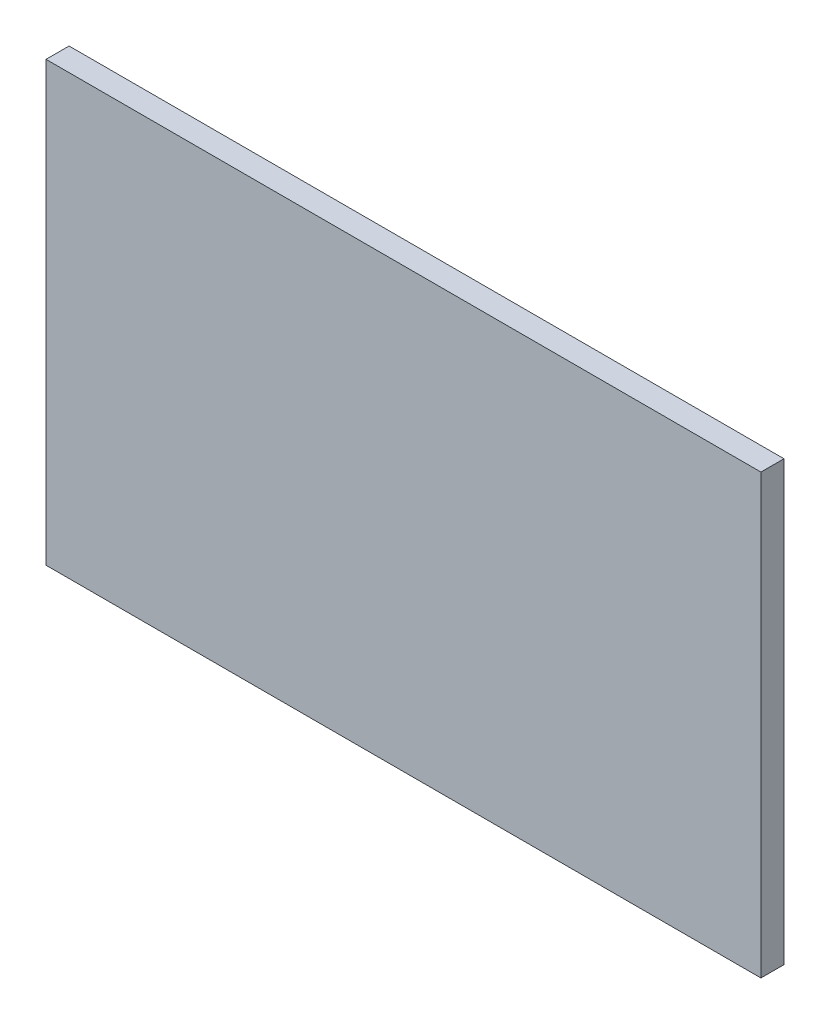
ISO-10303-21;
HEADER;
FILE_DESCRIPTION(('STEP AP214'),'2;1');
FILE_NAME('part.step','',(''),(''),'','','');
FILE_SCHEMA(('AUTOMOTIVE_DESIGN { 1 0 10303 214 1 1 1 1 }'));
ENDSEC;
DATA;
#1=APPLICATION_CONTEXT('core data for automotive mechanical design processes');
#2=APPLICATION_PROTOCOL_DEFINITION('international standard','automotive_design',2000,#1);
#3=PRODUCT_CONTEXT('',#1,'mechanical');
#4=PRODUCT('Part','Part','',(#3));
#5=PRODUCT_RELATED_PRODUCT_CATEGORY('part','',(#4));
#6=PRODUCT_DEFINITION_FORMATION('','',#4);
#7=PRODUCT_DEFINITION_CONTEXT('part definition',#1,'design');
#8=PRODUCT_DEFINITION('design','',#6,#7);
#9=PRODUCT_DEFINITION_SHAPE('','',#8);
#10=(LENGTH_UNIT() NAMED_UNIT(*) SI_UNIT(.MILLI.,.METRE.));
#11=(NAMED_UNIT(*) PLANE_ANGLE_UNIT() SI_UNIT($,.RADIAN.));
#12=(NAMED_UNIT(*) SI_UNIT($,.STERADIAN.) SOLID_ANGLE_UNIT());
#13=UNCERTAINTY_MEASURE_WITH_UNIT(LENGTH_MEASURE(1.E-05),#10,'distance_accuracy_value','');
#14=(GEOMETRIC_REPRESENTATION_CONTEXT(3) GLOBAL_UNCERTAINTY_ASSIGNED_CONTEXT((#13)) GLOBAL_UNIT_ASSIGNED_CONTEXT((#10,
#11,#12)) REPRESENTATION_CONTEXT('',''));
#15=CARTESIAN_POINT('',(0.,0.,0.));
#16=DIRECTION('',(0.,0.,1.));
#17=DIRECTION('',(1.,0.,0.));
#18=AXIS2_PLACEMENT_3D('',#15,#16,#17);
#19=CARTESIAN_POINT('',(15.5,9.5,1.));
#20=DIRECTION('',(0.,-1.,0.));
#21=DIRECTION('',(0.,0.,-1.));
#22=AXIS2_PLACEMENT_3D('',#19,#20,#21);
#23=PLANE('',#22);
#24=DIRECTION('',(-1.,0.,0.));
#25=VECTOR('',#24,1.);
#26=CARTESIAN_POINT('',(15.5,9.5,0.));
#27=LINE('',#26,#25);
#28=CARTESIAN_POINT('',(15.5,9.5,0.));
#29=VERTEX_POINT('',#28);
#30=CARTESIAN_POINT('',(-15.5,9.5,0.));
#31=VERTEX_POINT('',#30);
#32=EDGE_CURVE('E106',#29,#31,#27,.T.);
#33=ORIENTED_EDGE('',*,*,#32,.T.);
#34=DIRECTION('',(0.,0.,-1.));
#35=VECTOR('',#34,1.);
#36=CARTESIAN_POINT('',(-15.5,9.5,1.));
#37=LINE('',#36,#35);
#38=CARTESIAN_POINT('',(-15.5,9.5,1.));
#39=VERTEX_POINT('',#38);
#40=EDGE_CURVE('E11',#39,#31,#37,.T.);
#41=ORIENTED_EDGE('',*,*,#40,.F.);
#42=DIRECTION('',(-1.,0.,0.));
#43=VECTOR('',#42,1.);
#44=CARTESIAN_POINT('',(15.5,9.5,1.));
#45=LINE('',#44,#43);
#46=CARTESIAN_POINT('',(15.5,9.5,1.));
#47=VERTEX_POINT('',#46);
#48=EDGE_CURVE('E79',#47,#39,#45,.T.);
#49=ORIENTED_EDGE('',*,*,#48,.F.);
#50=DIRECTION('',(0.,0.,-1.));
#51=VECTOR('',#50,1.);
#52=CARTESIAN_POINT('',(15.5,9.5,1.));
#53=LINE('',#52,#51);
#54=EDGE_CURVE('E102',#47,#29,#53,.T.);
#55=ORIENTED_EDGE('',*,*,#54,.T.);
#56=EDGE_LOOP('',(#33,#41,#49,#55));
#57=FACE_BOUND('',#56,.T.);
#58=ADVANCED_FACE('F39',(#57),#23,.F.);
#59=CARTESIAN_POINT('',(-15.5,-9.5,1.));
#60=DIRECTION('',(-1.,0.,0.));
#61=DIRECTION('',(0.,0.,1.));
#62=AXIS2_PLACEMENT_3D('',#59,#60,#61);
#63=PLANE('',#62);
#64=DIRECTION('',(0.,1.,0.));
#65=VECTOR('',#64,1.);
#66=CARTESIAN_POINT('',(-15.5,-9.5,0.));
#67=LINE('',#66,#65);
#68=CARTESIAN_POINT('',(-15.5,-9.5,0.));
#69=VERTEX_POINT('',#68);
#70=EDGE_CURVE('E88',#69,#31,#67,.T.);
#71=ORIENTED_EDGE('',*,*,#70,.F.);
#72=DIRECTION('',(0.,0.,-1.));
#73=VECTOR('',#72,1.);
#74=CARTESIAN_POINT('',(-15.5,-9.5,1.));
#75=LINE('',#74,#73);
#76=CARTESIAN_POINT('',(-15.5,-9.5,1.));
#77=VERTEX_POINT('',#76);
#78=EDGE_CURVE('E48',#77,#69,#75,.T.);
#79=ORIENTED_EDGE('',*,*,#78,.F.);
#80=DIRECTION('',(0.,1.,0.));
#81=VECTOR('',#80,1.);
#82=CARTESIAN_POINT('',(-15.5,-9.5,1.));
#83=LINE('',#82,#81);
#84=EDGE_CURVE('E86',#77,#39,#83,.T.);
#85=ORIENTED_EDGE('',*,*,#84,.T.);
#86=ORIENTED_EDGE('',*,*,#40,.T.);
#87=EDGE_LOOP('',(#71,#79,#85,#86));
#88=FACE_BOUND('',#87,.T.);
#89=ADVANCED_FACE('F85',(#88),#63,.T.);
#90=CARTESIAN_POINT('',(15.5,-9.5,1.));
#91=DIRECTION('',(0.,-1.,0.));
#92=DIRECTION('',(0.,0.,-1.));
#93=AXIS2_PLACEMENT_3D('',#90,#91,#92);
#94=PLANE('',#93);
#95=DIRECTION('',(-1.,0.,0.));
#96=VECTOR('',#95,1.);
#97=CARTESIAN_POINT('',(15.5,-9.5,0.));
#98=LINE('',#97,#96);
#99=CARTESIAN_POINT('',(15.5,-9.5,0.));
#100=VERTEX_POINT('',#99);
#101=EDGE_CURVE('E112',#100,#69,#98,.T.);
#102=ORIENTED_EDGE('',*,*,#101,.F.);
#103=DIRECTION('',(0.,0.,-1.));
#104=VECTOR('',#103,1.);
#105=CARTESIAN_POINT('',(15.5,-9.5,1.));
#106=LINE('',#105,#104);
#107=CARTESIAN_POINT('',(15.5,-9.5,1.));
#108=VERTEX_POINT('',#107);
#109=EDGE_CURVE('E71',#108,#100,#106,.T.);
#110=ORIENTED_EDGE('',*,*,#109,.F.);
#111=DIRECTION('',(-1.,0.,0.));
#112=VECTOR('',#111,1.);
#113=CARTESIAN_POINT('',(15.5,-9.5,1.));
#114=LINE('',#113,#112);
#115=EDGE_CURVE('E95',#108,#77,#114,.T.);
#116=ORIENTED_EDGE('',*,*,#115,.T.);
#117=ORIENTED_EDGE('',*,*,#78,.T.);
#118=EDGE_LOOP('',(#102,#110,#116,#117));
#119=FACE_BOUND('',#118,.T.);
#120=ADVANCED_FACE('F98',(#119),#94,.T.);
#121=CARTESIAN_POINT('',(15.5,-9.5,1.));
#122=DIRECTION('',(-1.,0.,0.));
#123=DIRECTION('',(0.,0.,1.));
#124=AXIS2_PLACEMENT_3D('',#121,#122,#123);
#125=PLANE('',#124);
#126=DIRECTION('',(0.,1.,0.));
#127=VECTOR('',#126,1.);
#128=CARTESIAN_POINT('',(15.5,-9.5,0.));
#129=LINE('',#128,#127);
#130=EDGE_CURVE('E74',#100,#29,#129,.T.);
#131=ORIENTED_EDGE('',*,*,#130,.T.);
#132=ORIENTED_EDGE('',*,*,#54,.F.);
#133=DIRECTION('',(0.,1.,0.));
#134=VECTOR('',#133,1.);
#135=CARTESIAN_POINT('',(15.5,-9.5,1.));
#136=LINE('',#135,#134);
#137=EDGE_CURVE('E56',#108,#47,#136,.T.);
#138=ORIENTED_EDGE('',*,*,#137,.F.);
#139=ORIENTED_EDGE('',*,*,#109,.T.);
#140=EDGE_LOOP('',(#131,#132,#138,#139));
#141=FACE_BOUND('',#140,.T.);
#142=ADVANCED_FACE('F129',(#141),#125,.F.);
#143=CARTESIAN_POINT('',(0.,0.,1.));
#144=DIRECTION('',(0.,0.,-1.));
#145=DIRECTION('',(-1.,0.,0.));
#146=AXIS2_PLACEMENT_3D('',#143,#144,#145);
#147=PLANE('',#146);
#148=ORIENTED_EDGE('',*,*,#48,.T.);
#149=ORIENTED_EDGE('',*,*,#84,.F.);
#150=ORIENTED_EDGE('',*,*,#115,.F.);
#151=ORIENTED_EDGE('',*,*,#137,.T.);
#152=EDGE_LOOP('',(#148,#149,#150,#151));
#153=FACE_BOUND('',#152,.T.);
#154=ADVANCED_FACE('F94',(#153),#147,.F.);
#155=CARTESIAN_POINT('',(0.,0.,0.));
#156=DIRECTION('',(0.,0.,-1.));
#157=DIRECTION('',(-1.,0.,0.));
#158=AXIS2_PLACEMENT_3D('',#155,#156,#157);
#159=PLANE('',#158);
#160=ORIENTED_EDGE('',*,*,#32,.F.);
#161=ORIENTED_EDGE('',*,*,#130,.F.);
#162=ORIENTED_EDGE('',*,*,#101,.T.);
#163=ORIENTED_EDGE('',*,*,#70,.T.);
#164=EDGE_LOOP('',(#160,#161,#162,#163));
#165=FACE_BOUND('',#164,.T.);
#166=ADVANCED_FACE('F123',(#165),#159,.T.);
#167=CLOSED_SHELL('',(#58,#89,#120,#142,#154,#166));
#168=MANIFOLD_SOLID_BREP('B2',#167);
#169=ADVANCED_BREP_SHAPE_REPRESENTATION('',(#18,#168),#14);
#170=SHAPE_DEFINITION_REPRESENTATION(#9,#169);
ENDSEC;
END-ISO-10303-21;
